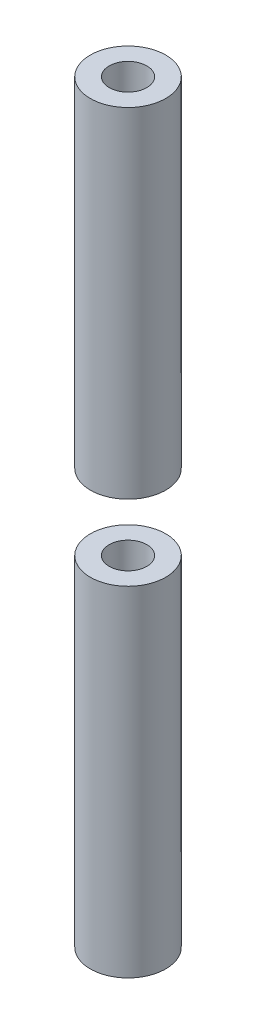
ISO-10303-21;
HEADER;
FILE_DESCRIPTION(('STEP AP214'),'2;1');
FILE_NAME('part.step','',(''),(''),'','','');
FILE_SCHEMA(('AUTOMOTIVE_DESIGN { 1 0 10303 214 1 1 1 1 }'));
ENDSEC;
DATA;
#1=APPLICATION_CONTEXT('core data for automotive mechanical design processes');
#2=APPLICATION_PROTOCOL_DEFINITION('international standard','automotive_design',2000,#1);
#3=PRODUCT_CONTEXT('',#1,'mechanical');
#4=PRODUCT('Part','Part','',(#3));
#5=PRODUCT_RELATED_PRODUCT_CATEGORY('part','',(#4));
#6=PRODUCT_DEFINITION_FORMATION('','',#4);
#7=PRODUCT_DEFINITION_CONTEXT('part definition',#1,'design');
#8=PRODUCT_DEFINITION('design','',#6,#7);
#9=PRODUCT_DEFINITION_SHAPE('','',#8);
#10=(LENGTH_UNIT() NAMED_UNIT(*) SI_UNIT(.MILLI.,.METRE.));
#11=(NAMED_UNIT(*) PLANE_ANGLE_UNIT() SI_UNIT($,.RADIAN.));
#12=(NAMED_UNIT(*) SI_UNIT($,.STERADIAN.) SOLID_ANGLE_UNIT());
#13=UNCERTAINTY_MEASURE_WITH_UNIT(LENGTH_MEASURE(1.E-05),#10,'distance_accuracy_value','');
#14=(GEOMETRIC_REPRESENTATION_CONTEXT(3) GLOBAL_UNCERTAINTY_ASSIGNED_CONTEXT((#13)) GLOBAL_UNIT_ASSIGNED_CONTEXT((#10,
#11,#12)) REPRESENTATION_CONTEXT('',''));
#15=CARTESIAN_POINT('',(0.,0.,0.));
#16=DIRECTION('',(0.,0.,1.));
#17=DIRECTION('',(1.,0.,0.));
#18=AXIS2_PLACEMENT_3D('',#15,#16,#17);
#19=CARTESIAN_POINT('',(0.,60.,0.));
#20=DIRECTION('',(0.,-1.,0.));
#21=DIRECTION('',(0.,0.,-1.));
#22=AXIS2_PLACEMENT_3D('',#19,#20,#21);
#23=CYLINDRICAL_SURFACE('',#22,2.5);
#24=CARTESIAN_POINT('',(0.,55.,0.));
#25=DIRECTION('',(0.,-1.,0.));
#26=DIRECTION('',(0.,0.,-1.));
#27=AXIS2_PLACEMENT_3D('',#24,#25,#26);
#28=CIRCLE('',#27,2.5);
#29=CARTESIAN_POINT('',(0.,55.,-2.5));
#30=VERTEX_POINT('',#29);
#31=EDGE_CURVE('E59',#30,#30,#28,.T.);
#32=CARTESIAN_POINT('',(0.,32.5,0.));
#33=DIRECTION('',(0.,1.,0.));
#34=DIRECTION('',(0.,0.,1.));
#35=AXIS2_PLACEMENT_3D('',#32,#33,#34);
#36=CIRCLE('',#35,2.5);
#37=CARTESIAN_POINT('',(0.,32.5,-2.5));
#38=VERTEX_POINT('',#37);
#39=EDGE_CURVE('E11',#38,#38,#36,.T.);
#40=CARTESIAN_POINT('',(0.,55.,-2.5));
#41=CARTESIAN_POINT('',(0.,54.765625,-2.5));
#42=CARTESIAN_POINT('',(0.,54.53125,-2.5));
#43=CARTESIAN_POINT('',(0.,54.0625,-2.5));
#44=CARTESIAN_POINT('',(0.,53.828125,-2.5));
#45=CARTESIAN_POINT('',(0.,53.359375,-2.5));
#46=CARTESIAN_POINT('',(0.,53.125,-2.5));
#47=CARTESIAN_POINT('',(0.,52.65625,-2.5));
#48=CARTESIAN_POINT('',(0.,52.421875,-2.5));
#49=CARTESIAN_POINT('',(0.,51.953125,-2.5));
#50=CARTESIAN_POINT('',(0.,51.71875,-2.5));
#51=CARTESIAN_POINT('',(0.,51.25,-2.5));
#52=CARTESIAN_POINT('',(0.,51.015625,-2.5));
#53=CARTESIAN_POINT('',(0.,50.546875,-2.5));
#54=CARTESIAN_POINT('',(0.,50.3125,-2.5));
#55=CARTESIAN_POINT('',(0.,49.84375,-2.5));
#56=CARTESIAN_POINT('',(0.,49.609375,-2.5));
#57=CARTESIAN_POINT('',(0.,49.140625,-2.5));
#58=CARTESIAN_POINT('',(0.,48.90625,-2.5));
#59=CARTESIAN_POINT('',(0.,48.4375,-2.5));
#60=CARTESIAN_POINT('',(0.,48.203125,-2.5));
#61=CARTESIAN_POINT('',(0.,47.734375,-2.5));
#62=CARTESIAN_POINT('',(0.,47.5,-2.5));
#63=CARTESIAN_POINT('',(0.,47.03125,-2.5));
#64=CARTESIAN_POINT('',(0.,46.796875,-2.5));
#65=CARTESIAN_POINT('',(0.,46.328125,-2.5));
#66=CARTESIAN_POINT('',(0.,46.09375,-2.5));
#67=CARTESIAN_POINT('',(0.,45.625,-2.5));
#68=CARTESIAN_POINT('',(0.,45.390625,-2.5));
#69=CARTESIAN_POINT('',(0.,44.921875,-2.5));
#70=CARTESIAN_POINT('',(0.,44.6875,-2.5));
#71=CARTESIAN_POINT('',(0.,44.21875,-2.5));
#72=CARTESIAN_POINT('',(0.,43.984375,-2.5));
#73=CARTESIAN_POINT('',(0.,43.515625,-2.5));
#74=CARTESIAN_POINT('',(0.,43.28125,-2.5));
#75=CARTESIAN_POINT('',(0.,42.8125,-2.5));
#76=CARTESIAN_POINT('',(0.,42.578125,-2.5));
#77=CARTESIAN_POINT('',(0.,42.109375,-2.5));
#78=CARTESIAN_POINT('',(0.,41.875,-2.5));
#79=CARTESIAN_POINT('',(0.,41.40625,-2.5));
#80=CARTESIAN_POINT('',(0.,41.171875,-2.5));
#81=CARTESIAN_POINT('',(0.,40.703125,-2.5));
#82=CARTESIAN_POINT('',(0.,40.46875,-2.5));
#83=CARTESIAN_POINT('',(0.,40.,-2.5));
#84=CARTESIAN_POINT('',(0.,39.765625,-2.5));
#85=CARTESIAN_POINT('',(0.,39.296875,-2.5));
#86=CARTESIAN_POINT('',(0.,39.0625,-2.5));
#87=CARTESIAN_POINT('',(0.,38.59375,-2.5));
#88=CARTESIAN_POINT('',(0.,38.359375,-2.5));
#89=CARTESIAN_POINT('',(0.,37.890625,-2.5));
#90=CARTESIAN_POINT('',(0.,37.65625,-2.5));
#91=CARTESIAN_POINT('',(0.,37.1875,-2.5));
#92=CARTESIAN_POINT('',(0.,36.953125,-2.5));
#93=CARTESIAN_POINT('',(0.,36.484375,-2.5));
#94=CARTESIAN_POINT('',(0.,36.25,-2.5));
#95=CARTESIAN_POINT('',(0.,35.78125,-2.5));
#96=CARTESIAN_POINT('',(0.,35.546875,-2.5));
#97=CARTESIAN_POINT('',(0.,35.078125,-2.5));
#98=CARTESIAN_POINT('',(0.,34.84375,-2.5));
#99=CARTESIAN_POINT('',(0.,34.375,-2.5));
#100=CARTESIAN_POINT('',(0.,34.140625,-2.5));
#101=CARTESIAN_POINT('',(0.,33.671875,-2.5));
#102=CARTESIAN_POINT('',(0.,33.4375,-2.5));
#103=CARTESIAN_POINT('',(0.,32.96875,-2.5));
#104=CARTESIAN_POINT('',(0.,32.734375,-2.5));
#105=CARTESIAN_POINT('',(0.,32.5,-2.5));
#106=B_SPLINE_CURVE_WITH_KNOTS('',3,(#40,#41,#42,#43,#44,#45,#46,#47,#48,#49,#50,#51,#52,#53,
#54,#55,#56,#57,#58,#59,#60,#61,#62,#63,#64,#65,#66,#67,#68,#69,#70,#71,#72,#73,#74,#75,#76,#77,
#78,#79,#80,#81,#82,#83,#84,#85,#86,#87,#88,#89,#90,#91,#92,#93,#94,#95,#96,#97,#98,#99,#100,
#101,#102,#103,#104,#105),.UNSPECIFIED.,.F.,.F.,(4,2,2,2,2,2,2,2,2,2,2,2,2,2,2,2,2,2,2,2,2,2,2,
2,2,2,2,2,2,2,2,2,4),(0.,0.703125000000006,1.40625,2.109375,2.8125,3.515625,4.21875000000001,
4.92187500000001,5.62500000000001,6.328125,7.03125000000001,7.73437500000001,8.43750000000001,
9.14062500000001,9.84375000000001,10.546875,11.25,11.953125,12.65625,13.359375,14.0625,
14.765625,15.46875,16.171875,16.875,17.578125,18.28125,18.984375,19.6875,20.390625,21.09375,
21.796875,22.5),.UNSPECIFIED.);
#107=EDGE_CURVE('BSEAM45',#30,#38,#106,.T.);
#108=ORIENTED_EDGE('',*,*,#31,.T.);
#109=ORIENTED_EDGE('',*,*,#39,.T.);
#110=ORIENTED_EDGE('',*,*,#107,.T.);
#111=ORIENTED_EDGE('',*,*,#107,.F.);
#112=EDGE_LOOP('',(#108,#110,#109,#111));
#113=FACE_BOUND('',#112,.T.);
#114=ADVANCED_FACE('F45',(#113),#23,.T.);
#115=CARTESIAN_POINT('',(-5.,32.5,0.));
#116=DIRECTION('',(0.,1.,0.));
#117=DIRECTION('',(0.,0.,1.));
#118=AXIS2_PLACEMENT_3D('',#115,#116,#117);
#119=PLANE('',#118);
#120=CARTESIAN_POINT('',(0.,32.5,0.));
#121=DIRECTION('',(0.,1.,0.));
#122=DIRECTION('',(0.,0.,1.));
#123=AXIS2_PLACEMENT_3D('',#120,#121,#122);
#124=CIRCLE('',#123,1.25);
#125=CARTESIAN_POINT('',(0.,32.5,-1.25));
#126=VERTEX_POINT('',#125);
#127=EDGE_CURVE('E53',#126,#126,#124,.F.);
#128=ORIENTED_EDGE('',*,*,#127,.F.);
#129=EDGE_LOOP('',(#128));
#130=FACE_BOUND('',#129,.T.);
#131=ORIENTED_EDGE('',*,*,#39,.F.);
#132=EDGE_LOOP('',(#131));
#133=FACE_BOUND('',#132,.T.);
#134=ADVANCED_FACE('F75',(#130,#133),#119,.F.);
#135=CARTESIAN_POINT('',(0.,60.,0.));
#136=DIRECTION('',(0.,-1.,0.));
#137=DIRECTION('',(0.,0.,-1.));
#138=AXIS2_PLACEMENT_3D('',#135,#136,#137);
#139=CYLINDRICAL_SURFACE('',#138,1.25);
#140=CARTESIAN_POINT('',(0.,55.,0.));
#141=DIRECTION('',(0.,-1.,0.));
#142=DIRECTION('',(0.,0.,-1.));
#143=AXIS2_PLACEMENT_3D('',#140,#141,#142);
#144=CIRCLE('',#143,1.25);
#145=CARTESIAN_POINT('',(0.,55.,-1.25));
#146=VERTEX_POINT('',#145);
#147=EDGE_CURVE('E48',#146,#146,#144,.T.);
#148=CARTESIAN_POINT('',(0.,55.,-1.25));
#149=CARTESIAN_POINT('',(0.,54.765625,-1.25));
#150=CARTESIAN_POINT('',(0.,54.53125,-1.25));
#151=CARTESIAN_POINT('',(0.,54.0625,-1.25));
#152=CARTESIAN_POINT('',(0.,53.828125,-1.25));
#153=CARTESIAN_POINT('',(0.,53.359375,-1.25));
#154=CARTESIAN_POINT('',(0.,53.125,-1.25));
#155=CARTESIAN_POINT('',(0.,52.65625,-1.25));
#156=CARTESIAN_POINT('',(0.,52.421875,-1.25));
#157=CARTESIAN_POINT('',(0.,51.953125,-1.25));
#158=CARTESIAN_POINT('',(0.,51.71875,-1.25));
#159=CARTESIAN_POINT('',(0.,51.25,-1.25));
#160=CARTESIAN_POINT('',(0.,51.015625,-1.25));
#161=CARTESIAN_POINT('',(0.,50.546875,-1.25));
#162=CARTESIAN_POINT('',(0.,50.3125,-1.25));
#163=CARTESIAN_POINT('',(0.,49.84375,-1.25));
#164=CARTESIAN_POINT('',(0.,49.609375,-1.25));
#165=CARTESIAN_POINT('',(0.,49.140625,-1.25));
#166=CARTESIAN_POINT('',(0.,48.90625,-1.25));
#167=CARTESIAN_POINT('',(0.,48.4375,-1.25));
#168=CARTESIAN_POINT('',(0.,48.203125,-1.25));
#169=CARTESIAN_POINT('',(0.,47.734375,-1.25));
#170=CARTESIAN_POINT('',(0.,47.5,-1.25));
#171=CARTESIAN_POINT('',(0.,47.03125,-1.25));
#172=CARTESIAN_POINT('',(0.,46.796875,-1.25));
#173=CARTESIAN_POINT('',(0.,46.328125,-1.25));
#174=CARTESIAN_POINT('',(0.,46.09375,-1.25));
#175=CARTESIAN_POINT('',(0.,45.625,-1.25));
#176=CARTESIAN_POINT('',(0.,45.390625,-1.25));
#177=CARTESIAN_POINT('',(0.,44.921875,-1.25));
#178=CARTESIAN_POINT('',(0.,44.6875,-1.25));
#179=CARTESIAN_POINT('',(0.,44.21875,-1.25));
#180=CARTESIAN_POINT('',(0.,43.984375,-1.25));
#181=CARTESIAN_POINT('',(0.,43.515625,-1.25));
#182=CARTESIAN_POINT('',(0.,43.28125,-1.25));
#183=CARTESIAN_POINT('',(0.,42.8125,-1.25));
#184=CARTESIAN_POINT('',(0.,42.578125,-1.25));
#185=CARTESIAN_POINT('',(0.,42.109375,-1.25));
#186=CARTESIAN_POINT('',(0.,41.875,-1.25));
#187=CARTESIAN_POINT('',(0.,41.40625,-1.25));
#188=CARTESIAN_POINT('',(0.,41.171875,-1.25));
#189=CARTESIAN_POINT('',(0.,40.703125,-1.25));
#190=CARTESIAN_POINT('',(0.,40.46875,-1.25));
#191=CARTESIAN_POINT('',(0.,40.,-1.25));
#192=CARTESIAN_POINT('',(0.,39.765625,-1.25));
#193=CARTESIAN_POINT('',(0.,39.296875,-1.25));
#194=CARTESIAN_POINT('',(0.,39.0625,-1.25));
#195=CARTESIAN_POINT('',(0.,38.59375,-1.25));
#196=CARTESIAN_POINT('',(0.,38.359375,-1.25));
#197=CARTESIAN_POINT('',(0.,37.890625,-1.25));
#198=CARTESIAN_POINT('',(0.,37.65625,-1.25));
#199=CARTESIAN_POINT('',(0.,37.1875,-1.25));
#200=CARTESIAN_POINT('',(0.,36.953125,-1.25));
#201=CARTESIAN_POINT('',(0.,36.484375,-1.25));
#202=CARTESIAN_POINT('',(0.,36.25,-1.25));
#203=CARTESIAN_POINT('',(0.,35.78125,-1.25));
#204=CARTESIAN_POINT('',(0.,35.546875,-1.25));
#205=CARTESIAN_POINT('',(0.,35.078125,-1.25));
#206=CARTESIAN_POINT('',(0.,34.84375,-1.25));
#207=CARTESIAN_POINT('',(0.,34.375,-1.25));
#208=CARTESIAN_POINT('',(0.,34.140625,-1.25));
#209=CARTESIAN_POINT('',(0.,33.671875,-1.25));
#210=CARTESIAN_POINT('',(0.,33.4375,-1.25));
#211=CARTESIAN_POINT('',(0.,32.96875,-1.25));
#212=CARTESIAN_POINT('',(0.,32.734375,-1.25));
#213=CARTESIAN_POINT('',(0.,32.5,-1.25));
#214=B_SPLINE_CURVE_WITH_KNOTS('',3,(#148,#149,#150,#151,#152,#153,#154,#155,#156,#157,#158,
#159,#160,#161,#162,#163,#164,#165,#166,#167,#168,#169,#170,#171,#172,#173,#174,#175,#176,#177,
#178,#179,#180,#181,#182,#183,#184,#185,#186,#187,#188,#189,#190,#191,#192,#193,#194,#195,#196,
#197,#198,#199,#200,#201,#202,#203,#204,#205,#206,#207,#208,#209,#210,#211,#212,#213),
.UNSPECIFIED.,.F.,.F.,(4,2,2,2,2,2,2,2,2,2,2,2,2,2,2,2,2,2,2,2,2,2,2,2,2,2,2,2,2,2,2,2,4),(0.,
0.703125000000006,1.40625,2.109375,2.8125,3.515625,4.21875000000001,4.92187500000001,
5.62500000000001,6.328125,7.03125000000001,7.73437500000001,8.43750000000001,9.14062500000001,
9.84375000000001,10.546875,11.25,11.953125,12.65625,13.359375,14.0625,14.765625,15.46875,
16.171875,16.875,17.578125,18.28125,18.984375,19.6875,20.390625,21.09375,21.796875,22.5),.UNSPECIFIED.);
#215=EDGE_CURVE('BSEAM72',#146,#126,#214,.T.);
#216=ORIENTED_EDGE('',*,*,#147,.F.);
#217=ORIENTED_EDGE('',*,*,#127,.T.);
#218=ORIENTED_EDGE('',*,*,#215,.T.);
#219=ORIENTED_EDGE('',*,*,#215,.F.);
#220=EDGE_LOOP('',(#216,#218,#217,#219));
#221=FACE_BOUND('',#220,.T.);
#222=ADVANCED_FACE('F72',(#221),#139,.F.);
#223=CARTESIAN_POINT('',(-25.,55.,2.5));
#224=DIRECTION('',(0.,-1.,0.));
#225=DIRECTION('',(0.,0.,-1.));
#226=AXIS2_PLACEMENT_3D('',#223,#224,#225);
#227=PLANE('',#226);
#228=ORIENTED_EDGE('',*,*,#147,.T.);
#229=EDGE_LOOP('',(#228));
#230=FACE_BOUND('',#229,.T.);
#231=ORIENTED_EDGE('',*,*,#31,.F.);
#232=EDGE_LOOP('',(#231));
#233=FACE_BOUND('',#232,.T.);
#234=ADVANCED_FACE('F69',(#230,#233),#227,.F.);
#235=CLOSED_SHELL('',(#114,#134,#222,#234));
#236=MANIFOLD_SOLID_BREP('B2',#235);
#237=CARTESIAN_POINT('',(0.,60.,0.));
#238=DIRECTION('',(0.,-1.,0.));
#239=DIRECTION('',(0.,0.,-1.));
#240=AXIS2_PLACEMENT_3D('',#237,#238,#239);
#241=CYLINDRICAL_SURFACE('',#240,2.5);
#242=CARTESIAN_POINT('',(0.,27.5,0.));
#243=DIRECTION('',(0.,-1.,0.));
#244=DIRECTION('',(0.,0.,-1.));
#245=AXIS2_PLACEMENT_3D('',#242,#243,#244);
#246=CIRCLE('',#245,2.5);
#247=CARTESIAN_POINT('',(0.,27.5,-2.5));
#248=VERTEX_POINT('',#247);
#249=EDGE_CURVE('E44',#248,#248,#246,.T.);
#250=CARTESIAN_POINT('',(0.,5.,0.));
#251=DIRECTION('',(0.,1.,0.));
#252=DIRECTION('',(0.,0.,1.));
#253=AXIS2_PLACEMENT_3D('',#250,#251,#252);
#254=CIRCLE('',#253,2.5);
#255=CARTESIAN_POINT('',(0.,4.99999999999999,-2.5));
#256=VERTEX_POINT('',#255);
#257=EDGE_CURVE('E126',#256,#256,#254,.T.);
#258=CARTESIAN_POINT('',(0.,27.5,-2.5));
#259=CARTESIAN_POINT('',(0.,27.265625,-2.5));
#260=CARTESIAN_POINT('',(0.,27.03125,-2.5));
#261=CARTESIAN_POINT('',(0.,26.5625,-2.5));
#262=CARTESIAN_POINT('',(0.,26.328125,-2.5));
#263=CARTESIAN_POINT('',(0.,25.859375,-2.5));
#264=CARTESIAN_POINT('',(0.,25.625,-2.5));
#265=CARTESIAN_POINT('',(0.,25.15625,-2.5));
#266=CARTESIAN_POINT('',(0.,24.921875,-2.5));
#267=CARTESIAN_POINT('',(0.,24.453125,-2.5));
#268=CARTESIAN_POINT('',(0.,24.21875,-2.5));
#269=CARTESIAN_POINT('',(0.,23.75,-2.5));
#270=CARTESIAN_POINT('',(0.,23.515625,-2.5));
#271=CARTESIAN_POINT('',(0.,23.046875,-2.5));
#272=CARTESIAN_POINT('',(0.,22.8125,-2.5));
#273=CARTESIAN_POINT('',(0.,22.34375,-2.5));
#274=CARTESIAN_POINT('',(0.,22.109375,-2.5));
#275=CARTESIAN_POINT('',(0.,21.640625,-2.5));
#276=CARTESIAN_POINT('',(0.,21.40625,-2.5));
#277=CARTESIAN_POINT('',(0.,20.9375,-2.5));
#278=CARTESIAN_POINT('',(0.,20.703125,-2.5));
#279=CARTESIAN_POINT('',(0.,20.234375,-2.5));
#280=CARTESIAN_POINT('',(0.,20.,-2.5));
#281=CARTESIAN_POINT('',(0.,19.53125,-2.5));
#282=CARTESIAN_POINT('',(0.,19.296875,-2.5));
#283=CARTESIAN_POINT('',(0.,18.828125,-2.5));
#284=CARTESIAN_POINT('',(0.,18.59375,-2.5));
#285=CARTESIAN_POINT('',(0.,18.125,-2.5));
#286=CARTESIAN_POINT('',(0.,17.890625,-2.5));
#287=CARTESIAN_POINT('',(0.,17.421875,-2.5));
#288=CARTESIAN_POINT('',(0.,17.1875,-2.5));
#289=CARTESIAN_POINT('',(0.,16.71875,-2.5));
#290=CARTESIAN_POINT('',(0.,16.484375,-2.5));
#291=CARTESIAN_POINT('',(0.,16.015625,-2.5));
#292=CARTESIAN_POINT('',(0.,15.78125,-2.5));
#293=CARTESIAN_POINT('',(0.,15.3125,-2.5));
#294=CARTESIAN_POINT('',(0.,15.078125,-2.5));
#295=CARTESIAN_POINT('',(0.,14.609375,-2.5));
#296=CARTESIAN_POINT('',(0.,14.375,-2.5));
#297=CARTESIAN_POINT('',(0.,13.90625,-2.5));
#298=CARTESIAN_POINT('',(0.,13.671875,-2.5));
#299=CARTESIAN_POINT('',(0.,13.203125,-2.5));
#300=CARTESIAN_POINT('',(0.,12.96875,-2.5));
#301=CARTESIAN_POINT('',(0.,12.5,-2.5));
#302=CARTESIAN_POINT('',(0.,12.265625,-2.5));
#303=CARTESIAN_POINT('',(0.,11.796875,-2.5));
#304=CARTESIAN_POINT('',(0.,11.5625,-2.5));
#305=CARTESIAN_POINT('',(0.,11.09375,-2.5));
#306=CARTESIAN_POINT('',(0.,10.859375,-2.5));
#307=CARTESIAN_POINT('',(0.,10.390625,-2.5));
#308=CARTESIAN_POINT('',(0.,10.15625,-2.5));
#309=CARTESIAN_POINT('',(0.,9.68749999999999,-2.5));
#310=CARTESIAN_POINT('',(0.,9.45312499999999,-2.5));
#311=CARTESIAN_POINT('',(0.,8.98437499999999,-2.5));
#312=CARTESIAN_POINT('',(0.,8.74999999999999,-2.5));
#313=CARTESIAN_POINT('',(0.,8.28124999999999,-2.5));
#314=CARTESIAN_POINT('',(0.,8.04687499999999,-2.5));
#315=CARTESIAN_POINT('',(0.,7.57812499999999,-2.5));
#316=CARTESIAN_POINT('',(0.,7.34374999999999,-2.5));
#317=CARTESIAN_POINT('',(0.,6.87499999999999,-2.5));
#318=CARTESIAN_POINT('',(0.,6.64062499999999,-2.5));
#319=CARTESIAN_POINT('',(0.,6.17187499999999,-2.5));
#320=CARTESIAN_POINT('',(0.,5.93749999999999,-2.5));
#321=CARTESIAN_POINT('',(0.,5.46874999999999,-2.5));
#322=CARTESIAN_POINT('',(0.,5.23437499999999,-2.5));
#323=CARTESIAN_POINT('',(0.,4.99999999999999,-2.5));
#324=B_SPLINE_CURVE_WITH_KNOTS('',3,(#258,#259,#260,#261,#262,#263,#264,#265,#266,#267,#268,
#269,#270,#271,#272,#273,#274,#275,#276,#277,#278,#279,#280,#281,#282,#283,#284,#285,#286,#287,
#288,#289,#290,#291,#292,#293,#294,#295,#296,#297,#298,#299,#300,#301,#302,#303,#304,#305,#306,
#307,#308,#309,#310,#311,#312,#313,#314,#315,#316,#317,#318,#319,#320,#321,#322,#323),
.UNSPECIFIED.,.F.,.F.,(4,2,2,2,2,2,2,2,2,2,2,2,2,2,2,2,2,2,2,2,2,2,2,2,2,2,2,2,2,2,2,2,4),(0.,
0.703124999999999,1.40625,2.109375,2.8125,3.515625,4.21875,4.921875,5.62500000000001,6.328125,
7.03125,7.734375,8.4375,9.140625,9.84375,10.546875,11.25,11.953125,12.65625,13.359375,14.0625,
14.765625,15.46875,16.171875,16.875,17.578125,18.28125,18.984375,19.6875,20.390625,21.09375,
21.796875,22.5),.UNSPECIFIED.);
#325=EDGE_CURVE('BSEAM114',#248,#256,#324,.T.);
#326=ORIENTED_EDGE('',*,*,#249,.T.);
#327=ORIENTED_EDGE('',*,*,#257,.T.);
#328=ORIENTED_EDGE('',*,*,#325,.T.);
#329=ORIENTED_EDGE('',*,*,#325,.F.);
#330=EDGE_LOOP('',(#326,#328,#327,#329));
#331=FACE_BOUND('',#330,.T.);
#332=ADVANCED_FACE('F114',(#331),#241,.T.);
#333=CARTESIAN_POINT('',(-5.,27.5,-14.1384187262691));
#334=DIRECTION('',(0.,-1.,0.));
#335=DIRECTION('',(0.,0.,-1.));
#336=AXIS2_PLACEMENT_3D('',#333,#334,#335);
#337=PLANE('',#336);
#338=CARTESIAN_POINT('',(0.,27.5,0.));
#339=DIRECTION('',(0.,-1.,0.));
#340=DIRECTION('',(0.,0.,-1.));
#341=AXIS2_PLACEMENT_3D('',#338,#339,#340);
#342=CIRCLE('',#341,1.25);
#343=CARTESIAN_POINT('',(0.,27.5,-1.25));
#344=VERTEX_POINT('',#343);
#345=EDGE_CURVE('E121',#344,#344,#342,.F.);
#346=ORIENTED_EDGE('',*,*,#345,.F.);
#347=EDGE_LOOP('',(#346));
#348=FACE_BOUND('',#347,.T.);
#349=ORIENTED_EDGE('',*,*,#249,.F.);
#350=EDGE_LOOP('',(#349));
#351=FACE_BOUND('',#350,.T.);
#352=ADVANCED_FACE('F140',(#348,#351),#337,.F.);
#353=CARTESIAN_POINT('',(0.,60.,0.));
#354=DIRECTION('',(0.,-1.,0.));
#355=DIRECTION('',(0.,0.,-1.));
#356=AXIS2_PLACEMENT_3D('',#353,#354,#355);
#357=CYLINDRICAL_SURFACE('',#356,1.25);
#358=CARTESIAN_POINT('',(0.,5.,0.));
#359=DIRECTION('',(0.,1.,0.));
#360=DIRECTION('',(0.,0.,1.));
#361=AXIS2_PLACEMENT_3D('',#358,#359,#360);
#362=CIRCLE('',#361,1.25);
#363=CARTESIAN_POINT('',(0.,4.99999999999999,-1.25));
#364=VERTEX_POINT('',#363);
#365=EDGE_CURVE('E117',#364,#364,#362,.T.);
#366=CARTESIAN_POINT('',(0.,4.99999999999999,-1.25));
#367=CARTESIAN_POINT('',(0.,5.23437499999999,-1.25));
#368=CARTESIAN_POINT('',(0.,5.46874999999999,-1.25));
#369=CARTESIAN_POINT('',(0.,5.93749999999999,-1.25));
#370=CARTESIAN_POINT('',(0.,6.17187499999999,-1.25));
#371=CARTESIAN_POINT('',(0.,6.64062499999999,-1.25));
#372=CARTESIAN_POINT('',(0.,6.87499999999999,-1.25));
#373=CARTESIAN_POINT('',(0.,7.34374999999999,-1.25));
#374=CARTESIAN_POINT('',(0.,7.57812499999999,-1.25));
#375=CARTESIAN_POINT('',(0.,8.04687499999999,-1.25));
#376=CARTESIAN_POINT('',(0.,8.28124999999999,-1.25));
#377=CARTESIAN_POINT('',(0.,8.74999999999999,-1.25));
#378=CARTESIAN_POINT('',(0.,8.98437499999999,-1.25));
#379=CARTESIAN_POINT('',(0.,9.45312499999999,-1.25));
#380=CARTESIAN_POINT('',(0.,9.68749999999999,-1.25));
#381=CARTESIAN_POINT('',(0.,10.15625,-1.25));
#382=CARTESIAN_POINT('',(0.,10.390625,-1.25));
#383=CARTESIAN_POINT('',(0.,10.859375,-1.25));
#384=CARTESIAN_POINT('',(0.,11.09375,-1.25));
#385=CARTESIAN_POINT('',(0.,11.5625,-1.25));
#386=CARTESIAN_POINT('',(0.,11.796875,-1.25));
#387=CARTESIAN_POINT('',(0.,12.265625,-1.25));
#388=CARTESIAN_POINT('',(0.,12.5,-1.25));
#389=CARTESIAN_POINT('',(0.,12.96875,-1.25));
#390=CARTESIAN_POINT('',(0.,13.203125,-1.25));
#391=CARTESIAN_POINT('',(0.,13.671875,-1.25));
#392=CARTESIAN_POINT('',(0.,13.90625,-1.25));
#393=CARTESIAN_POINT('',(0.,14.375,-1.25));
#394=CARTESIAN_POINT('',(0.,14.609375,-1.25));
#395=CARTESIAN_POINT('',(0.,15.078125,-1.25));
#396=CARTESIAN_POINT('',(0.,15.3125,-1.25));
#397=CARTESIAN_POINT('',(0.,15.78125,-1.25));
#398=CARTESIAN_POINT('',(0.,16.015625,-1.25));
#399=CARTESIAN_POINT('',(0.,16.484375,-1.25));
#400=CARTESIAN_POINT('',(0.,16.71875,-1.25));
#401=CARTESIAN_POINT('',(0.,17.1875,-1.25));
#402=CARTESIAN_POINT('',(0.,17.421875,-1.25));
#403=CARTESIAN_POINT('',(0.,17.890625,-1.25));
#404=CARTESIAN_POINT('',(0.,18.125,-1.25));
#405=CARTESIAN_POINT('',(0.,18.59375,-1.25));
#406=CARTESIAN_POINT('',(0.,18.828125,-1.25));
#407=CARTESIAN_POINT('',(0.,19.296875,-1.25));
#408=CARTESIAN_POINT('',(0.,19.53125,-1.25));
#409=CARTESIAN_POINT('',(0.,20.,-1.25));
#410=CARTESIAN_POINT('',(0.,20.234375,-1.25));
#411=CARTESIAN_POINT('',(0.,20.703125,-1.25));
#412=CARTESIAN_POINT('',(0.,20.9375,-1.25));
#413=CARTESIAN_POINT('',(0.,21.40625,-1.25));
#414=CARTESIAN_POINT('',(0.,21.640625,-1.25));
#415=CARTESIAN_POINT('',(0.,22.109375,-1.25));
#416=CARTESIAN_POINT('',(0.,22.34375,-1.25));
#417=CARTESIAN_POINT('',(0.,22.8125,-1.25));
#418=CARTESIAN_POINT('',(0.,23.046875,-1.25));
#419=CARTESIAN_POINT('',(0.,23.515625,-1.25));
#420=CARTESIAN_POINT('',(0.,23.75,-1.25));
#421=CARTESIAN_POINT('',(0.,24.21875,-1.25));
#422=CARTESIAN_POINT('',(0.,24.453125,-1.25));
#423=CARTESIAN_POINT('',(0.,24.921875,-1.25));
#424=CARTESIAN_POINT('',(0.,25.15625,-1.25));
#425=CARTESIAN_POINT('',(0.,25.625,-1.25));
#426=CARTESIAN_POINT('',(0.,25.859375,-1.25));
#427=CARTESIAN_POINT('',(0.,26.328125,-1.25));
#428=CARTESIAN_POINT('',(0.,26.5625,-1.25));
#429=CARTESIAN_POINT('',(0.,27.03125,-1.25));
#430=CARTESIAN_POINT('',(0.,27.265625,-1.25));
#431=CARTESIAN_POINT('',(0.,27.5,-1.25));
#432=B_SPLINE_CURVE_WITH_KNOTS('',3,(#366,#367,#368,#369,#370,#371,#372,#373,#374,#375,#376,
#377,#378,#379,#380,#381,#382,#383,#384,#385,#386,#387,#388,#389,#390,#391,#392,#393,#394,#395,
#396,#397,#398,#399,#400,#401,#402,#403,#404,#405,#406,#407,#408,#409,#410,#411,#412,#413,#414,
#415,#416,#417,#418,#419,#420,#421,#422,#423,#424,#425,#426,#427,#428,#429,#430,#431),
.UNSPECIFIED.,.F.,.F.,(4,2,2,2,2,2,2,2,2,2,2,2,2,2,2,2,2,2,2,2,2,2,2,2,2,2,2,2,2,2,2,2,4),(0.,
0.703124999999999,1.40625,2.109375,2.8125,3.515625,4.21875,4.921875,5.62500000000001,6.328125,
7.03125,7.734375,8.4375,9.140625,9.84375,10.546875,11.25,11.953125,12.65625,13.359375,14.0625,
14.765625,15.46875,16.171875,16.875,17.578125,18.28125,18.984375,19.6875,20.390625,21.09375,
21.796875,22.5),.UNSPECIFIED.);
#433=EDGE_CURVE('BSEAM137',#364,#344,#432,.T.);
#434=ORIENTED_EDGE('',*,*,#365,.F.);
#435=ORIENTED_EDGE('',*,*,#345,.T.);
#436=ORIENTED_EDGE('',*,*,#433,.T.);
#437=ORIENTED_EDGE('',*,*,#433,.F.);
#438=EDGE_LOOP('',(#434,#436,#435,#437));
#439=FACE_BOUND('',#438,.T.);
#440=ADVANCED_FACE('F137',(#439),#357,.F.);
#441=CARTESIAN_POINT('',(-25.,5.,2.5));
#442=DIRECTION('',(0.,1.,0.));
#443=DIRECTION('',(0.,0.,1.));
#444=AXIS2_PLACEMENT_3D('',#441,#442,#443);
#445=PLANE('',#444);
#446=ORIENTED_EDGE('',*,*,#365,.T.);
#447=EDGE_LOOP('',(#446));
#448=FACE_BOUND('',#447,.T.);
#449=ORIENTED_EDGE('',*,*,#257,.F.);
#450=EDGE_LOOP('',(#449));
#451=FACE_BOUND('',#450,.T.);
#452=ADVANCED_FACE('F134',(#448,#451),#445,.F.);
#453=CLOSED_SHELL('',(#332,#352,#440,#452));
#454=MANIFOLD_SOLID_BREP('B6',#453);
#455=ADVANCED_BREP_SHAPE_REPRESENTATION('',(#18,#236,#454),#14);
#456=SHAPE_DEFINITION_REPRESENTATION(#9,#455);
ENDSEC;
END-ISO-10303-21;
